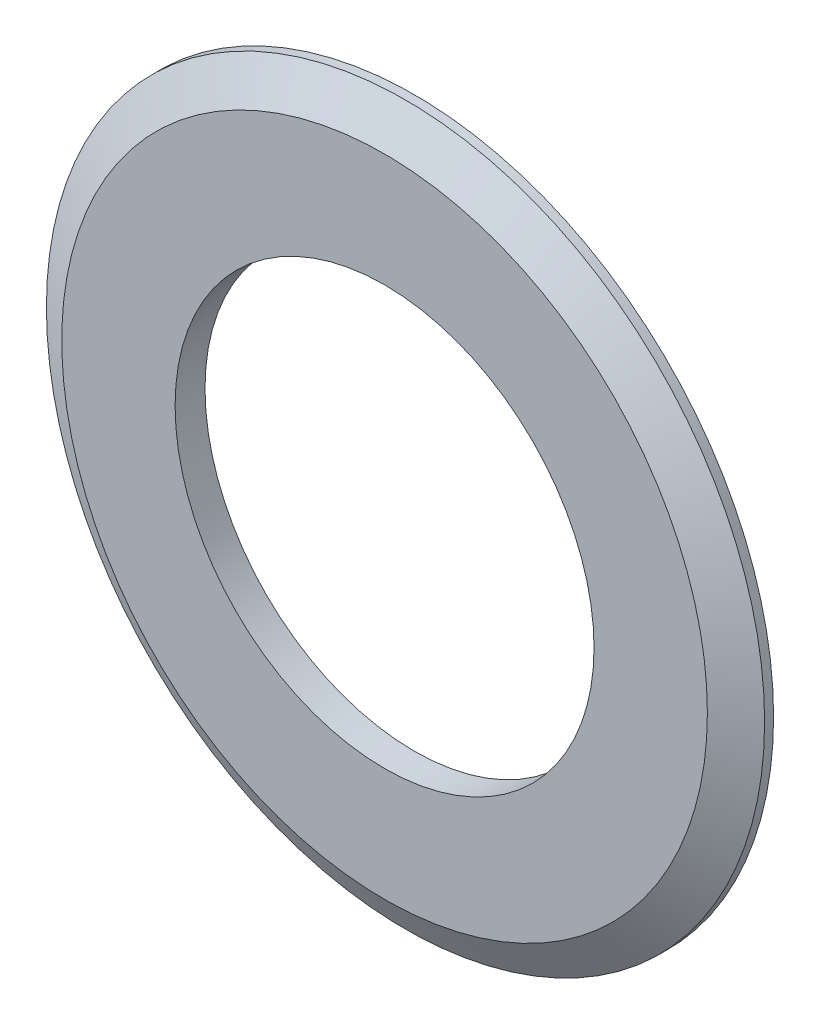
ISO-10303-21;
HEADER;
FILE_DESCRIPTION(('STEP AP214'),'2;1');
FILE_NAME('part.step','',(''),(''),'','','');
FILE_SCHEMA(('AUTOMOTIVE_DESIGN { 1 0 10303 214 1 1 1 1 }'));
ENDSEC;
DATA;
#1=APPLICATION_CONTEXT('core data for automotive mechanical design processes');
#2=APPLICATION_PROTOCOL_DEFINITION('international standard','automotive_design',2000,#1);
#3=PRODUCT_CONTEXT('',#1,'mechanical');
#4=PRODUCT('Part','Part','',(#3));
#5=PRODUCT_RELATED_PRODUCT_CATEGORY('part','',(#4));
#6=PRODUCT_DEFINITION_FORMATION('','',#4);
#7=PRODUCT_DEFINITION_CONTEXT('part definition',#1,'design');
#8=PRODUCT_DEFINITION('design','',#6,#7);
#9=PRODUCT_DEFINITION_SHAPE('','',#8);
#10=(LENGTH_UNIT() NAMED_UNIT(*) SI_UNIT(.MILLI.,.METRE.));
#11=(NAMED_UNIT(*) PLANE_ANGLE_UNIT() SI_UNIT($,.RADIAN.));
#12=(NAMED_UNIT(*) SI_UNIT($,.STERADIAN.) SOLID_ANGLE_UNIT());
#13=UNCERTAINTY_MEASURE_WITH_UNIT(LENGTH_MEASURE(1.E-05),#10,'distance_accuracy_value','');
#14=(GEOMETRIC_REPRESENTATION_CONTEXT(3) GLOBAL_UNCERTAINTY_ASSIGNED_CONTEXT((#13)) GLOBAL_UNIT_ASSIGNED_CONTEXT((#10,
#11,#12)) REPRESENTATION_CONTEXT('',''));
#15=CARTESIAN_POINT('',(0.,0.,0.));
#16=DIRECTION('',(0.,0.,1.));
#17=DIRECTION('',(1.,0.,0.));
#18=AXIS2_PLACEMENT_3D('',#15,#16,#17);
#19=CARTESIAN_POINT('',(0.,0.,1.));
#20=DIRECTION('',(0.,0.,-1.));
#21=DIRECTION('',(-1.,0.,0.));
#22=AXIS2_PLACEMENT_3D('',#19,#20,#21);
#23=CYLINDRICAL_SURFACE('',#22,12.);
#24=CARTESIAN_POINT('',(0.,0.,0.300000000000003));
#25=DIRECTION('',(0.,0.,1.));
#26=DIRECTION('',(1.,0.,0.));
#27=AXIS2_PLACEMENT_3D('',#24,#25,#26);
#28=CIRCLE('',#27,12.);
#29=CARTESIAN_POINT('',(12.,0.,0.300000000000003));
#30=VERTEX_POINT('',#29);
#31=EDGE_CURVE('E10',#30,#30,#28,.F.);
#32=ORIENTED_EDGE('',*,*,#31,.T.);
#33=EDGE_LOOP('',(#32));
#34=FACE_BOUND('',#33,.T.);
#35=CARTESIAN_POINT('',(0.,0.,0.));
#36=DIRECTION('',(0.,0.,1.));
#37=DIRECTION('',(1.,0.,0.));
#38=AXIS2_PLACEMENT_3D('',#35,#36,#37);
#39=CIRCLE('',#38,12.);
#40=CARTESIAN_POINT('',(12.,0.,0.));
#41=VERTEX_POINT('',#40);
#42=EDGE_CURVE('E47',#41,#41,#39,.T.);
#43=ORIENTED_EDGE('',*,*,#42,.T.);
#44=EDGE_LOOP('',(#43));
#45=FACE_BOUND('',#44,.T.);
#46=ADVANCED_FACE('F36',(#34,#45),#23,.T.);
#47=CARTESIAN_POINT('',(0.,0.,1.));
#48=DIRECTION('',(0.,0.,1.));
#49=DIRECTION('',(1.,0.,0.));
#50=AXIS2_PLACEMENT_3D('',#47,#48,#49);
#51=PLANE('',#50);
#52=CARTESIAN_POINT('',(0.,0.,1.));
#53=DIRECTION('',(0.,0.,1.));
#54=DIRECTION('',(1.,0.,0.));
#55=AXIS2_PLACEMENT_3D('',#52,#53,#54);
#56=CIRCLE('',#55,10.7875644347018);
#57=CARTESIAN_POINT('',(10.7875644347018,0.,1.));
#58=VERTEX_POINT('',#57);
#59=EDGE_CURVE('E43',#58,#58,#56,.T.);
#60=ORIENTED_EDGE('',*,*,#59,.T.);
#61=EDGE_LOOP('',(#60));
#62=FACE_BOUND('',#61,.T.);
#63=CARTESIAN_POINT('',(0.,0.,1.));
#64=DIRECTION('',(0.,0.,1.));
#65=DIRECTION('',(1.,0.,0.));
#66=AXIS2_PLACEMENT_3D('',#63,#64,#65);
#67=CIRCLE('',#66,7.);
#68=CARTESIAN_POINT('',(7.,0.,1.));
#69=VERTEX_POINT('',#68);
#70=EDGE_CURVE('E54',#69,#69,#67,.T.);
#71=ORIENTED_EDGE('',*,*,#70,.F.);
#72=EDGE_LOOP('',(#71));
#73=FACE_BOUND('',#72,.T.);
#74=ADVANCED_FACE('F69',(#62,#73),#51,.T.);
#75=CARTESIAN_POINT('',(0.,0.,0.));
#76=DIRECTION('',(0.,0.,1.));
#77=DIRECTION('',(1.,0.,0.));
#78=AXIS2_PLACEMENT_3D('',#75,#76,#77);
#79=PLANE('',#78);
#80=CARTESIAN_POINT('',(0.,0.,0.));
#81=DIRECTION('',(0.,0.,1.));
#82=DIRECTION('',(1.,0.,0.));
#83=AXIS2_PLACEMENT_3D('',#80,#81,#82);
#84=CIRCLE('',#83,7.);
#85=CARTESIAN_POINT('',(7.,0.,0.));
#86=VERTEX_POINT('',#85);
#87=EDGE_CURVE('E51',#86,#86,#84,.T.);
#88=ORIENTED_EDGE('',*,*,#87,.T.);
#89=EDGE_LOOP('',(#88));
#90=FACE_BOUND('',#89,.T.);
#91=ORIENTED_EDGE('',*,*,#42,.F.);
#92=EDGE_LOOP('',(#91));
#93=FACE_BOUND('',#92,.T.);
#94=ADVANCED_FACE('F60',(#90,#93),#79,.F.);
#95=CARTESIAN_POINT('',(0.,0.,0.));
#96=DIRECTION('',(0.,0.,1.));
#97=DIRECTION('',(1.,0.,0.));
#98=AXIS2_PLACEMENT_3D('',#95,#96,#97);
#99=CYLINDRICAL_SURFACE('',#98,7.);
#100=ORIENTED_EDGE('',*,*,#87,.F.);
#101=EDGE_LOOP('',(#100));
#102=FACE_BOUND('',#101,.T.);
#103=ORIENTED_EDGE('',*,*,#70,.T.);
#104=EDGE_LOOP('',(#103));
#105=FACE_BOUND('',#104,.T.);
#106=ADVANCED_FACE('F63',(#102,#105),#99,.F.);
#107=CARTESIAN_POINT('',(0.,0.,1.));
#108=DIRECTION('',(0.,0.,-1.));
#109=DIRECTION('',(-1.,0.,0.));
#110=AXIS2_PLACEMENT_3D('',#107,#108,#109);
#111=CONICAL_SURFACE('',#110,10.7875644347018,1.0471975511966);
#112=ORIENTED_EDGE('',*,*,#31,.F.);
#113=EDGE_LOOP('',(#112));
#114=FACE_BOUND('',#113,.T.);
#115=ORIENTED_EDGE('',*,*,#59,.F.);
#116=EDGE_LOOP('',(#115));
#117=FACE_BOUND('',#116,.T.);
#118=ADVANCED_FACE('F38',(#114,#117),#111,.T.);
#119=CLOSED_SHELL('',(#46,#74,#94,#106,#118));
#120=MANIFOLD_SOLID_BREP('B2',#119);
#121=ADVANCED_BREP_SHAPE_REPRESENTATION('',(#18,#120),#14);
#122=SHAPE_DEFINITION_REPRESENTATION(#9,#121);
ENDSEC;
END-ISO-10303-21;
